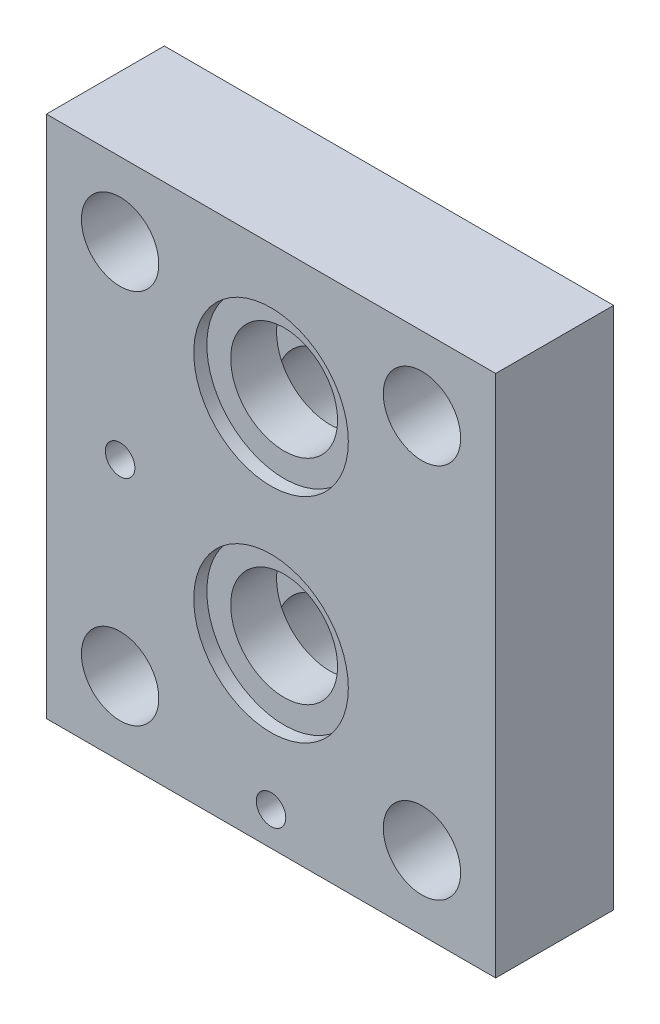
ISO-10303-21;
HEADER;
FILE_DESCRIPTION(('STEP AP214'),'2;1');
FILE_NAME('part.step','',(''),(''),'','','');
FILE_SCHEMA(('AUTOMOTIVE_DESIGN { 1 0 10303 214 1 1 1 1 }'));
ENDSEC;
DATA;
#1=APPLICATION_CONTEXT('core data for automotive mechanical design processes');
#2=APPLICATION_PROTOCOL_DEFINITION('international standard','automotive_design',2000,#1);
#3=PRODUCT_CONTEXT('',#1,'mechanical');
#4=PRODUCT('Part','Part','',(#3));
#5=PRODUCT_RELATED_PRODUCT_CATEGORY('part','',(#4));
#6=PRODUCT_DEFINITION_FORMATION('','',#4);
#7=PRODUCT_DEFINITION_CONTEXT('part definition',#1,'design');
#8=PRODUCT_DEFINITION('design','',#6,#7);
#9=PRODUCT_DEFINITION_SHAPE('','',#8);
#10=(LENGTH_UNIT() NAMED_UNIT(*) SI_UNIT(.MILLI.,.METRE.));
#11=(NAMED_UNIT(*) PLANE_ANGLE_UNIT() SI_UNIT($,.RADIAN.));
#12=(NAMED_UNIT(*) SI_UNIT($,.STERADIAN.) SOLID_ANGLE_UNIT());
#13=UNCERTAINTY_MEASURE_WITH_UNIT(LENGTH_MEASURE(1.E-05),#10,'distance_accuracy_value','');
#14=(GEOMETRIC_REPRESENTATION_CONTEXT(3) GLOBAL_UNCERTAINTY_ASSIGNED_CONTEXT((#13)) GLOBAL_UNIT_ASSIGNED_CONTEXT((#10,
#11,#12)) REPRESENTATION_CONTEXT('',''));
#15=CARTESIAN_POINT('',(0.,0.,0.));
#16=DIRECTION('',(0.,0.,1.));
#17=DIRECTION('',(1.,0.,0.));
#18=AXIS2_PLACEMENT_3D('',#15,#16,#17);
#19=CARTESIAN_POINT('',(0.,27.813,0.));
#20=DIRECTION('',(0.,0.,1.));
#21=DIRECTION('',(1.,0.,0.));
#22=AXIS2_PLACEMENT_3D('',#19,#20,#21);
#23=CYLINDRICAL_SURFACE('',#22,11.509375);
#24=CARTESIAN_POINT('',(0.,27.813,0.));
#25=DIRECTION('',(0.,0.,1.));
#26=DIRECTION('',(1.,0.,0.));
#27=AXIS2_PLACEMENT_3D('',#24,#25,#26);
#28=CIRCLE('',#27,11.509375);
#29=CARTESIAN_POINT('',(-10.4487050341478,22.987,0.));
#30=VERTEX_POINT('',#29);
#31=CARTESIAN_POINT('',(10.4487050341478,22.987,0.));
#32=VERTEX_POINT('',#31);
#33=EDGE_CURVE('E138',#30,#32,#28,.T.);
#34=ORIENTED_EDGE('',*,*,#33,.F.);
#35=EDGE_CURVE('E59',#32,#30,#28,.T.);
#36=ORIENTED_EDGE('',*,*,#35,.F.);
#37=EDGE_LOOP('',(#34,#36));
#38=FACE_BOUND('',#37,.T.);
#39=CARTESIAN_POINT('',(0.,27.813,9.8806));
#40=DIRECTION('',(0.,0.,1.));
#41=DIRECTION('',(1.,0.,0.));
#42=AXIS2_PLACEMENT_3D('',#39,#40,#41);
#43=CIRCLE('',#42,11.509375);
#44=CARTESIAN_POINT('',(11.509375,27.813,9.8806));
#45=VERTEX_POINT('',#44);
#46=EDGE_CURVE('E47',#45,#45,#43,.F.);
#47=ORIENTED_EDGE('',*,*,#46,.F.);
#48=EDGE_LOOP('',(#47));
#49=FACE_BOUND('',#48,.T.);
#50=ADVANCED_FACE('F43',(#38,#49),#23,.F.);
#51=CARTESIAN_POINT('',(0.,-18.161,0.));
#52=DIRECTION('',(0.,0.,1.));
#53=DIRECTION('',(1.,0.,0.));
#54=AXIS2_PLACEMENT_3D('',#51,#52,#53);
#55=CYLINDRICAL_SURFACE('',#54,11.509375);
#56=CARTESIAN_POINT('',(0.,-18.161,0.));
#57=DIRECTION('',(0.,0.,1.));
#58=DIRECTION('',(1.,0.,0.));
#59=AXIS2_PLACEMENT_3D('',#56,#57,#58);
#60=CIRCLE('',#59,11.509375);
#61=CARTESIAN_POINT('',(-10.4487050341478,-22.987,0.));
#62=VERTEX_POINT('',#61);
#63=CARTESIAN_POINT('',(10.4487050341478,-22.987,0.));
#64=VERTEX_POINT('',#63);
#65=EDGE_CURVE('E141',#62,#64,#60,.T.);
#66=ORIENTED_EDGE('',*,*,#65,.F.);
#67=EDGE_CURVE('E66',#64,#62,#60,.T.);
#68=ORIENTED_EDGE('',*,*,#67,.F.);
#69=EDGE_LOOP('',(#66,#68));
#70=FACE_BOUND('',#69,.T.);
#71=CARTESIAN_POINT('',(0.,-18.161,9.8806));
#72=DIRECTION('',(0.,0.,1.));
#73=DIRECTION('',(1.,0.,0.));
#74=AXIS2_PLACEMENT_3D('',#71,#72,#73);
#75=CIRCLE('',#74,11.509375);
#76=CARTESIAN_POINT('',(11.509375,-18.161,9.8806));
#77=VERTEX_POINT('',#76);
#78=EDGE_CURVE('E134',#77,#77,#75,.F.);
#79=ORIENTED_EDGE('',*,*,#78,.F.);
#80=EDGE_LOOP('',(#79));
#81=FACE_BOUND('',#80,.T.);
#82=ADVANCED_FACE('F273',(#70,#81),#55,.F.);
#83=CARTESIAN_POINT('',(48.387,56.388,12.7));
#84=DIRECTION('',(0.,-1.,0.));
#85=DIRECTION('',(0.,0.,-1.));
#86=AXIS2_PLACEMENT_3D('',#83,#84,#85);
#87=PLANE('',#86);
#88=DIRECTION('',(-1.,0.,0.));
#89=VECTOR('',#88,1.);
#90=CARTESIAN_POINT('',(48.387,56.388,-12.7));
#91=LINE('',#90,#89);
#92=CARTESIAN_POINT('',(48.387,56.388,-12.7));
#93=VERTEX_POINT('',#92);
#94=CARTESIAN_POINT('',(-48.387,56.388,-12.7));
#95=VERTEX_POINT('',#94);
#96=EDGE_CURVE('E182',#93,#95,#91,.T.);
#97=ORIENTED_EDGE('',*,*,#96,.T.);
#98=DIRECTION('',(0.,0.,-1.));
#99=VECTOR('',#98,1.);
#100=CARTESIAN_POINT('',(-48.387,56.388,12.7));
#101=LINE('',#100,#99);
#102=CARTESIAN_POINT('',(-48.387,56.388,12.7));
#103=VERTEX_POINT('',#102);
#104=EDGE_CURVE('E11',#103,#95,#101,.T.);
#105=ORIENTED_EDGE('',*,*,#104,.F.);
#106=DIRECTION('',(-1.,0.,0.));
#107=VECTOR('',#106,1.);
#108=CARTESIAN_POINT('',(48.387,56.388,12.7));
#109=LINE('',#108,#107);
#110=CARTESIAN_POINT('',(48.387,56.388,12.7));
#111=VERTEX_POINT('',#110);
#112=EDGE_CURVE('E183',#111,#103,#109,.T.);
#113=ORIENTED_EDGE('',*,*,#112,.F.);
#114=DIRECTION('',(0.,0.,-1.));
#115=VECTOR('',#114,1.);
#116=CARTESIAN_POINT('',(48.387,56.388,12.7));
#117=LINE('',#116,#115);
#118=EDGE_CURVE('E193',#111,#93,#117,.T.);
#119=ORIENTED_EDGE('',*,*,#118,.T.);
#120=EDGE_LOOP('',(#97,#105,#113,#119));
#121=FACE_BOUND('',#120,.T.);
#122=ADVANCED_FACE('F45',(#121),#87,.F.);
#123=CARTESIAN_POINT('',(-48.387,-56.388,12.7));
#124=DIRECTION('',(1.,0.,0.));
#125=DIRECTION('',(0.,0.,-1.));
#126=AXIS2_PLACEMENT_3D('',#123,#124,#125);
#127=PLANE('',#126);
#128=DIRECTION('',(0.,-1.,0.));
#129=VECTOR('',#128,1.);
#130=CARTESIAN_POINT('',(-48.387,-56.388,-12.7));
#131=LINE('',#130,#129);
#132=CARTESIAN_POINT('',(-48.387,-56.388,-12.7));
#133=VERTEX_POINT('',#132);
#134=EDGE_CURVE('E196',#95,#133,#131,.T.);
#135=ORIENTED_EDGE('',*,*,#134,.T.);
#136=DIRECTION('',(0.,0.,-1.));
#137=VECTOR('',#136,1.);
#138=CARTESIAN_POINT('',(-48.387,-56.388,12.7));
#139=LINE('',#138,#137);
#140=CARTESIAN_POINT('',(-48.387,-56.388,12.7));
#141=VERTEX_POINT('',#140);
#142=EDGE_CURVE('E52',#141,#133,#139,.T.);
#143=ORIENTED_EDGE('',*,*,#142,.F.);
#144=DIRECTION('',(0.,-1.,0.));
#145=VECTOR('',#144,1.);
#146=CARTESIAN_POINT('',(-48.387,-56.388,12.7));
#147=LINE('',#146,#145);
#148=EDGE_CURVE('E186',#103,#141,#147,.T.);
#149=ORIENTED_EDGE('',*,*,#148,.F.);
#150=ORIENTED_EDGE('',*,*,#104,.T.);
#151=EDGE_LOOP('',(#135,#143,#149,#150));
#152=FACE_BOUND('',#151,.T.);
#153=ADVANCED_FACE('F258',(#152),#127,.F.);
#154=CARTESIAN_POINT('',(48.387,-56.388,12.7));
#155=DIRECTION('',(0.,1.,0.));
#156=DIRECTION('',(0.,0.,1.));
#157=AXIS2_PLACEMENT_3D('',#154,#155,#156);
#158=PLANE('',#157);
#159=DIRECTION('',(1.,0.,0.));
#160=VECTOR('',#159,1.);
#161=CARTESIAN_POINT('',(48.387,-56.388,-12.7));
#162=LINE('',#161,#160);
#163=CARTESIAN_POINT('',(48.387,-56.388,-12.7));
#164=VERTEX_POINT('',#163);
#165=EDGE_CURVE('E198',#133,#164,#162,.T.);
#166=ORIENTED_EDGE('',*,*,#165,.T.);
#167=DIRECTION('',(0.,0.,-1.));
#168=VECTOR('',#167,1.);
#169=CARTESIAN_POINT('',(48.387,-56.388,12.7));
#170=LINE('',#169,#168);
#171=CARTESIAN_POINT('',(48.387,-56.388,12.7));
#172=VERTEX_POINT('',#171);
#173=EDGE_CURVE('E203',#172,#164,#170,.T.);
#174=ORIENTED_EDGE('',*,*,#173,.F.);
#175=DIRECTION('',(1.,0.,0.));
#176=VECTOR('',#175,1.);
#177=CARTESIAN_POINT('',(48.387,-56.388,12.7));
#178=LINE('',#177,#176);
#179=EDGE_CURVE('E189',#141,#172,#178,.T.);
#180=ORIENTED_EDGE('',*,*,#179,.F.);
#181=ORIENTED_EDGE('',*,*,#142,.T.);
#182=EDGE_LOOP('',(#166,#174,#180,#181));
#183=FACE_BOUND('',#182,.T.);
#184=ADVANCED_FACE('F255',(#183),#158,.F.);
#185=CARTESIAN_POINT('',(48.387,-56.388,12.7));
#186=DIRECTION('',(-1.,0.,0.));
#187=DIRECTION('',(0.,0.,1.));
#188=AXIS2_PLACEMENT_3D('',#185,#186,#187);
#189=PLANE('',#188);
#190=DIRECTION('',(0.,1.,0.));
#191=VECTOR('',#190,1.);
#192=CARTESIAN_POINT('',(48.387,-56.388,-12.7));
#193=LINE('',#192,#191);
#194=EDGE_CURVE('E187',#164,#93,#193,.T.);
#195=ORIENTED_EDGE('',*,*,#194,.T.);
#196=ORIENTED_EDGE('',*,*,#118,.F.);
#197=DIRECTION('',(0.,1.,0.));
#198=VECTOR('',#197,1.);
#199=CARTESIAN_POINT('',(48.387,-56.388,12.7));
#200=LINE('',#199,#198);
#201=EDGE_CURVE('E191',#172,#111,#200,.T.);
#202=ORIENTED_EDGE('',*,*,#201,.F.);
#203=ORIENTED_EDGE('',*,*,#173,.T.);
#204=EDGE_LOOP('',(#195,#196,#202,#203));
#205=FACE_BOUND('',#204,.T.);
#206=ADVANCED_FACE('F251',(#205),#189,.F.);
#207=CARTESIAN_POINT('',(0.,0.,12.7));
#208=DIRECTION('',(0.,0.,-1.));
#209=DIRECTION('',(-1.,0.,0.));
#210=AXIS2_PLACEMENT_3D('',#207,#208,#209);
#211=PLANE('',#210);
#212=CARTESIAN_POINT('',(0.,-49.149,12.7));
#213=DIRECTION('',(0.,0.,1.));
#214=DIRECTION('',(1.,0.,0.));
#215=AXIS2_PLACEMENT_3D('',#212,#213,#214);
#216=CIRCLE('',#215,3.175);
#217=CARTESIAN_POINT('',(3.175,-49.149,12.7));
#218=VERTEX_POINT('',#217);
#219=EDGE_CURVE('E485',#218,#218,#216,.T.);
#220=ORIENTED_EDGE('',*,*,#219,.F.);
#221=EDGE_LOOP('',(#220));
#222=FACE_BOUND('',#221,.T.);
#223=CARTESIAN_POINT('',(-32.512,-0.127000000000009,12.7));
#224=DIRECTION('',(0.,0.,1.));
#225=DIRECTION('',(1.,0.,0.));
#226=AXIS2_PLACEMENT_3D('',#223,#224,#225);
#227=CIRCLE('',#226,3.175);
#228=CARTESIAN_POINT('',(-29.337,-0.127000000000009,12.7));
#229=VERTEX_POINT('',#228);
#230=EDGE_CURVE('E488',#229,#229,#227,.T.);
#231=ORIENTED_EDGE('',*,*,#230,.F.);
#232=EDGE_LOOP('',(#231));
#233=FACE_BOUND('',#232,.T.);
#234=CARTESIAN_POINT('',(0.,27.813,12.7));
#235=DIRECTION('',(0.,0.,1.));
#236=DIRECTION('',(1.,0.,0.));
#237=AXIS2_PLACEMENT_3D('',#234,#235,#236);
#238=CIRCLE('',#237,16.6497);
#239=CARTESIAN_POINT('',(16.6497,27.813,12.7));
#240=VERTEX_POINT('',#239);
#241=EDGE_CURVE('E125',#240,#240,#238,.T.);
#242=ORIENTED_EDGE('',*,*,#241,.F.);
#243=EDGE_LOOP('',(#242));
#244=FACE_BOUND('',#243,.T.);
#245=CARTESIAN_POINT('',(0.,-18.161,12.7));
#246=DIRECTION('',(0.,0.,1.));
#247=DIRECTION('',(1.,0.,0.));
#248=AXIS2_PLACEMENT_3D('',#245,#246,#247);
#249=CIRCLE('',#248,16.6497);
#250=CARTESIAN_POINT('',(16.6497,-18.161,12.7));
#251=VERTEX_POINT('',#250);
#252=EDGE_CURVE('E135',#251,#251,#249,.T.);
#253=ORIENTED_EDGE('',*,*,#252,.F.);
#254=EDGE_LOOP('',(#253));
#255=FACE_BOUND('',#254,.T.);
#256=CARTESIAN_POINT('',(32.512,40.513,12.7));
#257=DIRECTION('',(0.,0.,-1.));
#258=DIRECTION('',(-1.,0.,0.));
#259=AXIS2_PLACEMENT_3D('',#256,#257,#258);
#260=CIRCLE('',#259,8.33437499999998);
#261=CARTESIAN_POINT('',(24.177625,40.513,12.7));
#262=VERTEX_POINT('',#261);
#263=EDGE_CURVE('E161',#262,#262,#260,.T.);
#264=ORIENTED_EDGE('',*,*,#263,.T.);
#265=EDGE_LOOP('',(#264));
#266=FACE_BOUND('',#265,.T.);
#267=CARTESIAN_POINT('',(-32.512,-40.513,12.7));
#268=DIRECTION('',(0.,0.,-1.));
#269=DIRECTION('',(-1.,0.,0.));
#270=AXIS2_PLACEMENT_3D('',#267,#268,#269);
#271=CIRCLE('',#270,8.33437499999998);
#272=CARTESIAN_POINT('',(-40.846375,-40.513,12.7));
#273=VERTEX_POINT('',#272);
#274=EDGE_CURVE('E167',#273,#273,#271,.T.);
#275=ORIENTED_EDGE('',*,*,#274,.T.);
#276=EDGE_LOOP('',(#275));
#277=FACE_BOUND('',#276,.T.);
#278=CARTESIAN_POINT('',(-32.512,40.513,12.7));
#279=DIRECTION('',(0.,0.,-1.));
#280=DIRECTION('',(-1.,0.,0.));
#281=AXIS2_PLACEMENT_3D('',#278,#279,#280);
#282=CIRCLE('',#281,8.33437499999998);
#283=CARTESIAN_POINT('',(-40.846375,40.513,12.7));
#284=VERTEX_POINT('',#283);
#285=EDGE_CURVE('E173',#284,#284,#282,.T.);
#286=ORIENTED_EDGE('',*,*,#285,.T.);
#287=EDGE_LOOP('',(#286));
#288=FACE_BOUND('',#287,.T.);
#289=CARTESIAN_POINT('',(32.512,-40.513,12.7));
#290=DIRECTION('',(0.,0.,-1.));
#291=DIRECTION('',(-1.,0.,0.));
#292=AXIS2_PLACEMENT_3D('',#289,#290,#291);
#293=CIRCLE('',#292,8.33437499999998);
#294=CARTESIAN_POINT('',(24.177625,-40.513,12.7));
#295=VERTEX_POINT('',#294);
#296=EDGE_CURVE('E179',#295,#295,#293,.T.);
#297=ORIENTED_EDGE('',*,*,#296,.T.);
#298=EDGE_LOOP('',(#297));
#299=FACE_BOUND('',#298,.T.);
#300=ORIENTED_EDGE('',*,*,#112,.T.);
#301=ORIENTED_EDGE('',*,*,#148,.T.);
#302=ORIENTED_EDGE('',*,*,#179,.T.);
#303=ORIENTED_EDGE('',*,*,#201,.T.);
#304=EDGE_LOOP('',(#300,#301,#302,#303));
#305=FACE_BOUND('',#304,.T.);
#306=ADVANCED_FACE('F229',(#222,#233,#244,#255,#266,#277,#288,#299,#305),#211,.F.);
#307=CARTESIAN_POINT('',(0.,0.,-12.7));
#308=DIRECTION('',(0.,0.,-1.));
#309=DIRECTION('',(-1.,0.,0.));
#310=AXIS2_PLACEMENT_3D('',#307,#308,#309);
#311=PLANE('',#310);
#312=CARTESIAN_POINT('',(0.,49.149,-12.7));
#313=DIRECTION('',(0.,0.,-1.));
#314=DIRECTION('',(-1.,0.,0.));
#315=AXIS2_PLACEMENT_3D('',#312,#313,#314);
#316=CIRCLE('',#315,3.57187499999999);
#317=CARTESIAN_POINT('',(-3.57187499999999,49.149,-12.7));
#318=VERTEX_POINT('',#317);
#319=EDGE_CURVE('E113',#318,#318,#316,.T.);
#320=ORIENTED_EDGE('',*,*,#319,.F.);
#321=EDGE_LOOP('',(#320));
#322=FACE_BOUND('',#321,.T.);
#323=CARTESIAN_POINT('',(32.512,0.126999999999986,-12.7));
#324=DIRECTION('',(0.,0.,-1.));
#325=DIRECTION('',(-1.,0.,0.));
#326=AXIS2_PLACEMENT_3D('',#323,#324,#325);
#327=CIRCLE('',#326,3.57187499999999);
#328=CARTESIAN_POINT('',(28.940125,0.126999999999986,-12.7));
#329=VERTEX_POINT('',#328);
#330=EDGE_CURVE('E112',#329,#329,#327,.T.);
#331=ORIENTED_EDGE('',*,*,#330,.F.);
#332=EDGE_LOOP('',(#331));
#333=FACE_BOUND('',#332,.T.);
#334=CARTESIAN_POINT('',(0.,18.161,-12.7));
#335=DIRECTION('',(0.,0.,1.));
#336=DIRECTION('',(1.,0.,0.));
#337=AXIS2_PLACEMENT_3D('',#334,#335,#336);
#338=CIRCLE('',#337,11.509375);
#339=CARTESIAN_POINT('',(11.509375,18.161,-12.7));
#340=VERTEX_POINT('',#339);
#341=EDGE_CURVE('E144',#340,#340,#338,.T.);
#342=ORIENTED_EDGE('',*,*,#341,.T.);
#343=EDGE_LOOP('',(#342));
#344=FACE_BOUND('',#343,.T.);
#345=CARTESIAN_POINT('',(0.,-27.813,-12.7));
#346=DIRECTION('',(0.,0.,1.));
#347=DIRECTION('',(1.,0.,0.));
#348=AXIS2_PLACEMENT_3D('',#345,#346,#347);
#349=CIRCLE('',#348,11.509375);
#350=CARTESIAN_POINT('',(11.509375,-27.813,-12.7));
#351=VERTEX_POINT('',#350);
#352=EDGE_CURVE('E148',#351,#351,#349,.T.);
#353=ORIENTED_EDGE('',*,*,#352,.T.);
#354=EDGE_LOOP('',(#353));
#355=FACE_BOUND('',#354,.T.);
#356=CARTESIAN_POINT('',(32.512,40.513,-12.7));
#357=DIRECTION('',(0.,0.,-1.));
#358=DIRECTION('',(-1.,0.,0.));
#359=AXIS2_PLACEMENT_3D('',#356,#357,#358);
#360=CIRCLE('',#359,8.33437499999999);
#361=CARTESIAN_POINT('',(24.177625,40.513,-12.7));
#362=VERTEX_POINT('',#361);
#363=EDGE_CURVE('E155',#362,#362,#360,.T.);
#364=ORIENTED_EDGE('',*,*,#363,.F.);
#365=EDGE_LOOP('',(#364));
#366=FACE_BOUND('',#365,.T.);
#367=CARTESIAN_POINT('',(-32.512,-40.513,-12.7));
#368=DIRECTION('',(0.,0.,-1.));
#369=DIRECTION('',(-1.,0.,0.));
#370=AXIS2_PLACEMENT_3D('',#367,#368,#369);
#371=CIRCLE('',#370,8.33437499999999);
#372=CARTESIAN_POINT('',(-40.846375,-40.513,-12.7));
#373=VERTEX_POINT('',#372);
#374=EDGE_CURVE('E164',#373,#373,#371,.T.);
#375=ORIENTED_EDGE('',*,*,#374,.F.);
#376=EDGE_LOOP('',(#375));
#377=FACE_BOUND('',#376,.T.);
#378=CARTESIAN_POINT('',(-32.512,40.513,-12.7));
#379=DIRECTION('',(0.,0.,-1.));
#380=DIRECTION('',(-1.,0.,0.));
#381=AXIS2_PLACEMENT_3D('',#378,#379,#380);
#382=CIRCLE('',#381,8.33437499999999);
#383=CARTESIAN_POINT('',(-40.846375,40.513,-12.7));
#384=VERTEX_POINT('',#383);
#385=EDGE_CURVE('E170',#384,#384,#382,.T.);
#386=ORIENTED_EDGE('',*,*,#385,.F.);
#387=EDGE_LOOP('',(#386));
#388=FACE_BOUND('',#387,.T.);
#389=CARTESIAN_POINT('',(32.512,-40.513,-12.7));
#390=DIRECTION('',(0.,0.,-1.));
#391=DIRECTION('',(-1.,0.,0.));
#392=AXIS2_PLACEMENT_3D('',#389,#390,#391);
#393=CIRCLE('',#392,8.33437499999999);
#394=CARTESIAN_POINT('',(24.177625,-40.513,-12.7));
#395=VERTEX_POINT('',#394);
#396=EDGE_CURVE('E176',#395,#395,#393,.T.);
#397=ORIENTED_EDGE('',*,*,#396,.F.);
#398=EDGE_LOOP('',(#397));
#399=FACE_BOUND('',#398,.T.);
#400=ORIENTED_EDGE('',*,*,#96,.F.);
#401=ORIENTED_EDGE('',*,*,#194,.F.);
#402=ORIENTED_EDGE('',*,*,#165,.F.);
#403=ORIENTED_EDGE('',*,*,#134,.F.);
#404=EDGE_LOOP('',(#400,#401,#402,#403));
#405=FACE_BOUND('',#404,.T.);
#406=ADVANCED_FACE('F225',(#322,#333,#344,#355,#366,#377,#388,#399,#405),#311,.T.);
#407=CARTESIAN_POINT('',(32.512,-40.513,-12.7));
#408=DIRECTION('',(0.,0.,-1.));
#409=DIRECTION('',(-1.,0.,0.));
#410=AXIS2_PLACEMENT_3D('',#407,#408,#409);
#411=CYLINDRICAL_SURFACE('',#410,8.33437499999999);
#412=ORIENTED_EDGE('',*,*,#296,.F.);
#413=EDGE_LOOP('',(#412));
#414=FACE_BOUND('',#413,.T.);
#415=ORIENTED_EDGE('',*,*,#396,.T.);
#416=EDGE_LOOP('',(#415));
#417=FACE_BOUND('',#416,.T.);
#418=ADVANCED_FACE('F228',(#414,#417),#411,.F.);
#419=CARTESIAN_POINT('',(-32.512,40.513,-12.7));
#420=DIRECTION('',(0.,0.,-1.));
#421=DIRECTION('',(-1.,0.,0.));
#422=AXIS2_PLACEMENT_3D('',#419,#420,#421);
#423=CYLINDRICAL_SURFACE('',#422,8.33437499999999);
#424=ORIENTED_EDGE('',*,*,#285,.F.);
#425=EDGE_LOOP('',(#424));
#426=FACE_BOUND('',#425,.T.);
#427=ORIENTED_EDGE('',*,*,#385,.T.);
#428=EDGE_LOOP('',(#427));
#429=FACE_BOUND('',#428,.T.);
#430=ADVANCED_FACE('F304',(#426,#429),#423,.F.);
#431=CARTESIAN_POINT('',(-32.512,-40.513,-12.7));
#432=DIRECTION('',(0.,0.,-1.));
#433=DIRECTION('',(-1.,0.,0.));
#434=AXIS2_PLACEMENT_3D('',#431,#432,#433);
#435=CYLINDRICAL_SURFACE('',#434,8.33437499999999);
#436=ORIENTED_EDGE('',*,*,#274,.F.);
#437=EDGE_LOOP('',(#436));
#438=FACE_BOUND('',#437,.T.);
#439=ORIENTED_EDGE('',*,*,#374,.T.);
#440=EDGE_LOOP('',(#439));
#441=FACE_BOUND('',#440,.T.);
#442=ADVANCED_FACE('F300',(#438,#441),#435,.F.);
#443=CARTESIAN_POINT('',(32.512,40.513,-12.7));
#444=DIRECTION('',(0.,0.,-1.));
#445=DIRECTION('',(-1.,0.,0.));
#446=AXIS2_PLACEMENT_3D('',#443,#444,#445);
#447=CYLINDRICAL_SURFACE('',#446,8.33437499999999);
#448=ORIENTED_EDGE('',*,*,#263,.F.);
#449=EDGE_LOOP('',(#448));
#450=FACE_BOUND('',#449,.T.);
#451=ORIENTED_EDGE('',*,*,#363,.T.);
#452=EDGE_LOOP('',(#451));
#453=FACE_BOUND('',#452,.T.);
#454=ADVANCED_FACE('F296',(#450,#453),#447,.F.);
#455=CARTESIAN_POINT('',(0.,-27.813,0.));
#456=DIRECTION('',(0.,0.,-1.));
#457=DIRECTION('',(-1.,0.,0.));
#458=AXIS2_PLACEMENT_3D('',#455,#456,#457);
#459=CYLINDRICAL_SURFACE('',#458,11.509375);
#460=CARTESIAN_POINT('',(0.,-27.813,0.));
#461=DIRECTION('',(0.,0.,1.));
#462=DIRECTION('',(1.,0.,0.));
#463=AXIS2_PLACEMENT_3D('',#460,#461,#462);
#464=CIRCLE('',#463,11.509375);
#465=EDGE_CURVE('E152',#64,#62,#464,.T.);
#466=ORIENTED_EDGE('',*,*,#465,.T.);
#467=EDGE_CURVE('E156',#62,#64,#464,.T.);
#468=ORIENTED_EDGE('',*,*,#467,.T.);
#469=EDGE_LOOP('',(#466,#468));
#470=FACE_BOUND('',#469,.T.);
#471=ORIENTED_EDGE('',*,*,#352,.F.);
#472=EDGE_LOOP('',(#471));
#473=FACE_BOUND('',#472,.T.);
#474=ADVANCED_FACE('F292',(#470,#473),#459,.F.);
#475=CARTESIAN_POINT('',(0.,-27.813,0.));
#476=DIRECTION('',(0.,0.,1.));
#477=DIRECTION('',(1.,0.,0.));
#478=AXIS2_PLACEMENT_3D('',#475,#476,#477);
#479=PLANE('',#478);
#480=ORIENTED_EDGE('',*,*,#467,.F.);
#481=ORIENTED_EDGE('',*,*,#65,.T.);
#482=EDGE_LOOP('',(#480,#481));
#483=FACE_BOUND('',#482,.T.);
#484=ADVANCED_FACE('F221',(#483),#479,.F.);
#485=CARTESIAN_POINT('',(0.,18.161,0.));
#486=DIRECTION('',(0.,0.,-1.));
#487=DIRECTION('',(-1.,0.,0.));
#488=AXIS2_PLACEMENT_3D('',#485,#486,#487);
#489=CYLINDRICAL_SURFACE('',#488,11.509375);
#490=CARTESIAN_POINT('',(0.,18.161,0.));
#491=DIRECTION('',(0.,0.,1.));
#492=DIRECTION('',(1.,0.,0.));
#493=AXIS2_PLACEMENT_3D('',#490,#491,#492);
#494=CIRCLE('',#493,11.509375);
#495=EDGE_CURVE('E145',#32,#30,#494,.T.);
#496=ORIENTED_EDGE('',*,*,#495,.T.);
#497=EDGE_CURVE('E149',#30,#32,#494,.T.);
#498=ORIENTED_EDGE('',*,*,#497,.T.);
#499=EDGE_LOOP('',(#496,#498));
#500=FACE_BOUND('',#499,.T.);
#501=ORIENTED_EDGE('',*,*,#341,.F.);
#502=EDGE_LOOP('',(#501));
#503=FACE_BOUND('',#502,.T.);
#504=ADVANCED_FACE('F218',(#500,#503),#489,.F.);
#505=CARTESIAN_POINT('',(0.,18.161,0.));
#506=DIRECTION('',(0.,0.,1.));
#507=DIRECTION('',(1.,0.,0.));
#508=AXIS2_PLACEMENT_3D('',#505,#506,#507);
#509=PLANE('',#508);
#510=ORIENTED_EDGE('',*,*,#497,.F.);
#511=ORIENTED_EDGE('',*,*,#33,.T.);
#512=EDGE_LOOP('',(#510,#511));
#513=FACE_BOUND('',#512,.T.);
#514=ADVANCED_FACE('F216',(#513),#509,.F.);
#515=CARTESIAN_POINT('',(0.,-18.161,0.));
#516=DIRECTION('',(0.,0.,1.));
#517=DIRECTION('',(1.,0.,0.));
#518=AXIS2_PLACEMENT_3D('',#515,#516,#517);
#519=PLANE('',#518);
#520=ORIENTED_EDGE('',*,*,#67,.T.);
#521=ORIENTED_EDGE('',*,*,#465,.F.);
#522=EDGE_LOOP('',(#520,#521));
#523=FACE_BOUND('',#522,.T.);
#524=ADVANCED_FACE('F284',(#523),#519,.T.);
#525=CARTESIAN_POINT('',(0.,27.813,0.));
#526=DIRECTION('',(0.,0.,1.));
#527=DIRECTION('',(1.,0.,0.));
#528=AXIS2_PLACEMENT_3D('',#525,#526,#527);
#529=PLANE('',#528);
#530=ORIENTED_EDGE('',*,*,#35,.T.);
#531=ORIENTED_EDGE('',*,*,#495,.F.);
#532=EDGE_LOOP('',(#530,#531));
#533=FACE_BOUND('',#532,.T.);
#534=ADVANCED_FACE('F211',(#533),#529,.T.);
#535=CARTESIAN_POINT('',(0.,-18.161,9.8806));
#536=DIRECTION('',(0.,0.,1.));
#537=DIRECTION('',(1.,0.,0.));
#538=AXIS2_PLACEMENT_3D('',#535,#536,#537);
#539=PLANE('',#538);
#540=CARTESIAN_POINT('',(0.,-18.161,9.8806));
#541=DIRECTION('',(0.,0.,1.));
#542=DIRECTION('',(1.,0.,0.));
#543=AXIS2_PLACEMENT_3D('',#540,#541,#542);
#544=CIRCLE('',#543,16.6497);
#545=CARTESIAN_POINT('',(16.6497,-18.161,9.8806));
#546=VERTEX_POINT('',#545);
#547=EDGE_CURVE('E131',#546,#546,#544,.T.);
#548=ORIENTED_EDGE('',*,*,#547,.T.);
#549=EDGE_LOOP('',(#548));
#550=FACE_BOUND('',#549,.T.);
#551=ORIENTED_EDGE('',*,*,#78,.T.);
#552=EDGE_LOOP('',(#551));
#553=FACE_BOUND('',#552,.T.);
#554=ADVANCED_FACE('F365',(#550,#553),#539,.T.);
#555=CARTESIAN_POINT('',(0.,-18.161,9.8806));
#556=DIRECTION('',(0.,0.,1.));
#557=DIRECTION('',(1.,0.,0.));
#558=AXIS2_PLACEMENT_3D('',#555,#556,#557);
#559=CYLINDRICAL_SURFACE('',#558,16.6497);
#560=ORIENTED_EDGE('',*,*,#547,.F.);
#561=EDGE_LOOP('',(#560));
#562=FACE_BOUND('',#561,.T.);
#563=ORIENTED_EDGE('',*,*,#252,.T.);
#564=EDGE_LOOP('',(#563));
#565=FACE_BOUND('',#564,.T.);
#566=ADVANCED_FACE('F377',(#562,#565),#559,.F.);
#567=CARTESIAN_POINT('',(0.,27.813,9.8806));
#568=DIRECTION('',(0.,0.,1.));
#569=DIRECTION('',(1.,0.,0.));
#570=AXIS2_PLACEMENT_3D('',#567,#568,#569);
#571=PLANE('',#570);
#572=CARTESIAN_POINT('',(0.,27.813,9.8806));
#573=DIRECTION('',(0.,0.,1.));
#574=DIRECTION('',(1.,0.,0.));
#575=AXIS2_PLACEMENT_3D('',#572,#573,#574);
#576=CIRCLE('',#575,16.6497);
#577=CARTESIAN_POINT('',(16.6497,27.813,9.8806));
#578=VERTEX_POINT('',#577);
#579=EDGE_CURVE('E126',#578,#578,#576,.T.);
#580=ORIENTED_EDGE('',*,*,#579,.T.);
#581=EDGE_LOOP('',(#580));
#582=FACE_BOUND('',#581,.T.);
#583=ORIENTED_EDGE('',*,*,#46,.T.);
#584=EDGE_LOOP('',(#583));
#585=FACE_BOUND('',#584,.T.);
#586=ADVANCED_FACE('F384',(#582,#585),#571,.T.);
#587=CARTESIAN_POINT('',(0.,27.813,9.8806));
#588=DIRECTION('',(0.,0.,1.));
#589=DIRECTION('',(1.,0.,0.));
#590=AXIS2_PLACEMENT_3D('',#587,#588,#589);
#591=CYLINDRICAL_SURFACE('',#590,16.6497);
#592=ORIENTED_EDGE('',*,*,#579,.F.);
#593=EDGE_LOOP('',(#592));
#594=FACE_BOUND('',#593,.T.);
#595=ORIENTED_EDGE('',*,*,#241,.T.);
#596=EDGE_LOOP('',(#595));
#597=FACE_BOUND('',#596,.T.);
#598=ADVANCED_FACE('F399',(#594,#597),#591,.F.);
#599=CARTESIAN_POINT('',(32.512,0.126999999999986,-4.82600000000001));
#600=DIRECTION('',(0.,0.,-1.));
#601=DIRECTION('',(-1.,0.,0.));
#602=AXIS2_PLACEMENT_3D('',#599,#600,#601);
#603=CONICAL_SURFACE('',#602,3.57187499999999,1.02974425867665);
#604=CARTESIAN_POINT('',(32.512,0.126999999999986,-2.67980097641094));
#605=VERTEX_POINT('',#604);
#606=VERTEX_LOOP('',#605);
#607=FACE_BOUND('',#606,.T.);
#608=CARTESIAN_POINT('',(32.512,0.126999999999986,-4.82600000000001));
#609=DIRECTION('',(0.,0.,-1.));
#610=DIRECTION('',(-1.,0.,0.));
#611=AXIS2_PLACEMENT_3D('',#608,#609,#610);
#612=CIRCLE('',#611,3.57187499999999);
#613=CARTESIAN_POINT('',(28.940125,0.126999999999986,-4.82600000000001));
#614=VERTEX_POINT('',#613);
#615=EDGE_CURVE('E116',#614,#614,#612,.T.);
#616=ORIENTED_EDGE('',*,*,#615,.T.);
#617=EDGE_LOOP('',(#616));
#618=FACE_BOUND('',#617,.T.);
#619=ADVANCED_FACE('F409',(#607,#618),#603,.F.);
#620=CARTESIAN_POINT('',(32.512,0.126999999999986,-12.7));
#621=DIRECTION('',(0.,0.,-1.));
#622=DIRECTION('',(-1.,0.,0.));
#623=AXIS2_PLACEMENT_3D('',#620,#621,#622);
#624=CYLINDRICAL_SURFACE('',#623,3.57187499999999);
#625=ORIENTED_EDGE('',*,*,#615,.F.);
#626=EDGE_LOOP('',(#625));
#627=FACE_BOUND('',#626,.T.);
#628=ORIENTED_EDGE('',*,*,#330,.T.);
#629=EDGE_LOOP('',(#628));
#630=FACE_BOUND('',#629,.T.);
#631=ADVANCED_FACE('F106',(#627,#630),#624,.F.);
#632=CARTESIAN_POINT('',(0.,49.149,-4.82600000000001));
#633=DIRECTION('',(0.,0.,-1.));
#634=DIRECTION('',(-1.,0.,0.));
#635=AXIS2_PLACEMENT_3D('',#632,#633,#634);
#636=CONICAL_SURFACE('',#635,3.57187499999999,1.02974425867665);
#637=CARTESIAN_POINT('',(0.,49.149,-2.67980097641094));
#638=VERTEX_POINT('',#637);
#639=VERTEX_LOOP('',#638);
#640=FACE_BOUND('',#639,.T.);
#641=CARTESIAN_POINT('',(0.,49.149,-4.82600000000001));
#642=DIRECTION('',(0.,0.,-1.));
#643=DIRECTION('',(-1.,0.,0.));
#644=AXIS2_PLACEMENT_3D('',#641,#642,#643);
#645=CIRCLE('',#644,3.57187499999999);
#646=CARTESIAN_POINT('',(-3.57187499999999,49.149,-4.82600000000001));
#647=VERTEX_POINT('',#646);
#648=EDGE_CURVE('E110',#647,#647,#645,.T.);
#649=ORIENTED_EDGE('',*,*,#648,.T.);
#650=EDGE_LOOP('',(#649));
#651=FACE_BOUND('',#650,.T.);
#652=ADVANCED_FACE('F102',(#640,#651),#636,.F.);
#653=CARTESIAN_POINT('',(0.,49.149,-12.7));
#654=DIRECTION('',(0.,0.,-1.));
#655=DIRECTION('',(-1.,0.,0.));
#656=AXIS2_PLACEMENT_3D('',#653,#654,#655);
#657=CYLINDRICAL_SURFACE('',#656,3.57187499999999);
#658=ORIENTED_EDGE('',*,*,#648,.F.);
#659=EDGE_LOOP('',(#658));
#660=FACE_BOUND('',#659,.T.);
#661=ORIENTED_EDGE('',*,*,#319,.T.);
#662=EDGE_LOOP('',(#661));
#663=FACE_BOUND('',#662,.T.);
#664=ADVANCED_FACE('F105',(#660,#663),#657,.F.);
#665=CARTESIAN_POINT('',(-32.512,-0.127000000000009,4.826));
#666=DIRECTION('',(0.,0.,1.));
#667=DIRECTION('',(1.,0.,0.));
#668=AXIS2_PLACEMENT_3D('',#665,#666,#667);
#669=CYLINDRICAL_SURFACE('',#668,3.175);
#670=CARTESIAN_POINT('',(-32.512,-0.127000000000009,4.826));
#671=DIRECTION('',(0.,0.,1.));
#672=DIRECTION('',(1.,0.,0.));
#673=AXIS2_PLACEMENT_3D('',#670,#671,#672);
#674=CIRCLE('',#673,3.175);
#675=CARTESIAN_POINT('',(-29.337,-0.127000000000009,4.826));
#676=VERTEX_POINT('',#675);
#677=EDGE_CURVE('E492',#676,#676,#674,.T.);
#678=ORIENTED_EDGE('',*,*,#677,.F.);
#679=EDGE_LOOP('',(#678));
#680=FACE_BOUND('',#679,.T.);
#681=ORIENTED_EDGE('',*,*,#230,.T.);
#682=EDGE_LOOP('',(#681));
#683=FACE_BOUND('',#682,.T.);
#684=ADVANCED_FACE('F442',(#680,#683),#669,.F.);
#685=CARTESIAN_POINT('',(-32.512,-0.127000000000009,4.826));
#686=DIRECTION('',(0.,0.,1.));
#687=DIRECTION('',(1.,0.,0.));
#688=AXIS2_PLACEMENT_3D('',#685,#686,#687);
#689=PLANE('',#688);
#690=ORIENTED_EDGE('',*,*,#677,.T.);
#691=EDGE_LOOP('',(#690));
#692=FACE_BOUND('',#691,.T.);
#693=ADVANCED_FACE('F450',(#692),#689,.T.);
#694=CARTESIAN_POINT('',(0.,-49.149,4.826));
#695=DIRECTION('',(0.,0.,1.));
#696=DIRECTION('',(1.,0.,0.));
#697=AXIS2_PLACEMENT_3D('',#694,#695,#696);
#698=CYLINDRICAL_SURFACE('',#697,3.175);
#699=CARTESIAN_POINT('',(0.,-49.149,4.826));
#700=DIRECTION('',(0.,0.,1.));
#701=DIRECTION('',(1.,0.,0.));
#702=AXIS2_PLACEMENT_3D('',#699,#700,#701);
#703=CIRCLE('',#702,3.175);
#704=CARTESIAN_POINT('',(3.175,-49.149,4.826));
#705=VERTEX_POINT('',#704);
#706=EDGE_CURVE('E119',#705,#705,#703,.T.);
#707=ORIENTED_EDGE('',*,*,#706,.F.);
#708=EDGE_LOOP('',(#707));
#709=FACE_BOUND('',#708,.T.);
#710=ORIENTED_EDGE('',*,*,#219,.T.);
#711=EDGE_LOOP('',(#710));
#712=FACE_BOUND('',#711,.T.);
#713=ADVANCED_FACE('F460',(#709,#712),#698,.F.);
#714=CARTESIAN_POINT('',(0.,-49.149,4.826));
#715=DIRECTION('',(0.,0.,1.));
#716=DIRECTION('',(1.,0.,0.));
#717=AXIS2_PLACEMENT_3D('',#714,#715,#716);
#718=PLANE('',#717);
#719=ORIENTED_EDGE('',*,*,#706,.T.);
#720=EDGE_LOOP('',(#719));
#721=FACE_BOUND('',#720,.T.);
#722=ADVANCED_FACE('F470',(#721),#718,.T.);
#723=CLOSED_SHELL('',(#50,#82,#122,#153,#184,#206,#306,#406,#418,#430,#442,#454,#474,#484,#504,
#514,#524,#534,#554,#566,#586,#598,#619,#631,#652,#664,#684,#693,#713,#722));
#724=MANIFOLD_SOLID_BREP('B2',#723);
#725=ADVANCED_BREP_SHAPE_REPRESENTATION('',(#18,#724),#14);
#726=SHAPE_DEFINITION_REPRESENTATION(#9,#725);
ENDSEC;
END-ISO-10303-21;
